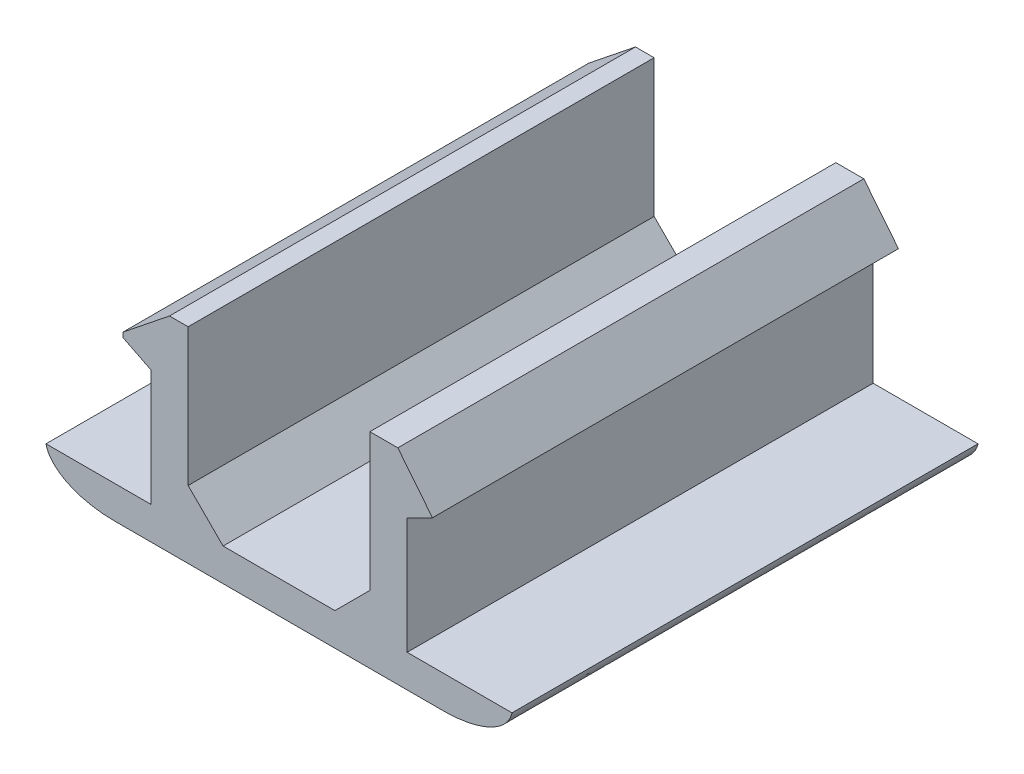
ISO-10303-21;
HEADER;
FILE_DESCRIPTION(('STEP AP214'),'2;1');
FILE_NAME('part.step','',(''),(''),'','','');
FILE_SCHEMA(('AUTOMOTIVE_DESIGN { 1 0 10303 214 1 1 1 1 }'));
ENDSEC;
DATA;
#1=APPLICATION_CONTEXT('core data for automotive mechanical design processes');
#2=APPLICATION_PROTOCOL_DEFINITION('international standard','automotive_design',2000,#1);
#3=PRODUCT_CONTEXT('',#1,'mechanical');
#4=PRODUCT('Part','Part','',(#3));
#5=PRODUCT_RELATED_PRODUCT_CATEGORY('part','',(#4));
#6=PRODUCT_DEFINITION_FORMATION('','',#4);
#7=PRODUCT_DEFINITION_CONTEXT('part definition',#1,'design');
#8=PRODUCT_DEFINITION('design','',#6,#7);
#9=PRODUCT_DEFINITION_SHAPE('','',#8);
#10=(LENGTH_UNIT() NAMED_UNIT(*) SI_UNIT(.MILLI.,.METRE.));
#11=(NAMED_UNIT(*) PLANE_ANGLE_UNIT() SI_UNIT($,.RADIAN.));
#12=(NAMED_UNIT(*) SI_UNIT($,.STERADIAN.) SOLID_ANGLE_UNIT());
#13=UNCERTAINTY_MEASURE_WITH_UNIT(LENGTH_MEASURE(1.E-05),#10,'distance_accuracy_value','');
#14=(GEOMETRIC_REPRESENTATION_CONTEXT(3) GLOBAL_UNCERTAINTY_ASSIGNED_CONTEXT((#13)) GLOBAL_UNIT_ASSIGNED_CONTEXT((#10,
#11,#12)) REPRESENTATION_CONTEXT('',''));
#15=CARTESIAN_POINT('',(0.,0.,0.));
#16=DIRECTION('',(0.,0.,1.));
#17=DIRECTION('',(1.,0.,0.));
#18=AXIS2_PLACEMENT_3D('',#15,#16,#17);
#19=CARTESIAN_POINT('',(0.,0.,10.));
#20=DIRECTION('',(0.,1.,0.));
#21=DIRECTION('',(0.,0.,1.));
#22=AXIS2_PLACEMENT_3D('',#19,#20,#21);
#23=PLANE('',#22);
#24=DIRECTION('',(1.,0.,0.));
#25=VECTOR('',#24,1.);
#26=CARTESIAN_POINT('',(0.,0.,10.));
#27=LINE('',#26,#25);
#28=CARTESIAN_POINT('',(1.46969384566986,0.,10.));
#29=VERTEX_POINT('',#28);
#30=CARTESIAN_POINT('',(8.53030615433009,0.,10.));
#31=VERTEX_POINT('',#30);
#32=EDGE_CURVE('E183',#29,#31,#27,.T.);
#33=ORIENTED_EDGE('',*,*,#32,.F.);
#34=CARTESIAN_POINT('',(1.46969384566991,0.,-0.5));
#35=CARTESIAN_POINT('',(1.46969384566991,0.,3.16666666666667));
#36=CARTESIAN_POINT('',(1.46969384566991,0.,6.83333333333332));
#37=CARTESIAN_POINT('',(1.46969384566991,0.,10.5));
#38=(BOUNDED_CURVE() B_SPLINE_CURVE(3,(#34,#35,#36,#37),.UNSPECIFIED.,.F.,
.F.) B_SPLINE_CURVE_WITH_KNOTS((4,4),(-0.0005,0.0105),
.UNSPECIFIED.) CURVE() GEOMETRIC_REPRESENTATION_ITEM() RATIONAL_B_SPLINE_CURVE((1.,1.,1.,1.)) REPRESENTATION_ITEM(''));
#39=CARTESIAN_POINT('',(1.46969384566991,0.,0.));
#40=VERTEX_POINT('',#39);
#41=EDGE_CURVE('E528',#29,#40,#38,.F.);
#42=ORIENTED_EDGE('',*,*,#41,.T.);
#43=DIRECTION('',(1.,0.,0.));
#44=VECTOR('',#43,1.);
#45=CARTESIAN_POINT('',(0.,0.,0.));
#46=LINE('',#45,#44);
#47=CARTESIAN_POINT('',(8.53030615433009,0.,0.));
#48=VERTEX_POINT('',#47);
#49=EDGE_CURVE('E417',#40,#48,#46,.T.);
#50=ORIENTED_EDGE('',*,*,#49,.T.);
#51=CARTESIAN_POINT('',(8.53030615433009,0.,10.5));
#52=CARTESIAN_POINT('',(8.53030615433009,0.,6.83333333333332));
#53=CARTESIAN_POINT('',(8.53030615433009,0.,3.16666666666667));
#54=CARTESIAN_POINT('',(8.53030615433009,0.,-0.5));
#55=(BOUNDED_CURVE() B_SPLINE_CURVE(3,(#51,#52,#53,#54),.UNSPECIFIED.,.F.,
.F.) B_SPLINE_CURVE_WITH_KNOTS((4,4),(-0.0005,0.0105),
.UNSPECIFIED.) CURVE() GEOMETRIC_REPRESENTATION_ITEM() RATIONAL_B_SPLINE_CURVE((1.,1.,1.,1.)) REPRESENTATION_ITEM(''));
#56=EDGE_CURVE('E207',#48,#31,#55,.F.);
#57=ORIENTED_EDGE('',*,*,#56,.T.);
#58=EDGE_LOOP('',(#33,#42,#50,#57));
#59=FACE_BOUND('',#58,.T.);
#60=ADVANCED_FACE('F45',(#59),#23,.F.);
#61=CARTESIAN_POINT('',(10.,0.7,10.));
#62=DIRECTION('',(0.,-1.,0.));
#63=DIRECTION('',(0.,0.,-1.));
#64=AXIS2_PLACEMENT_3D('',#61,#62,#63);
#65=PLANE('',#64);
#66=DIRECTION('',(-1.,0.,0.));
#67=VECTOR('',#66,1.);
#68=CARTESIAN_POINT('',(10.,0.7,0.));
#69=LINE('',#68,#67);
#70=CARTESIAN_POINT('',(10.,0.7,0.));
#71=VERTEX_POINT('',#70);
#72=CARTESIAN_POINT('',(7.75,0.7,0.));
#73=VERTEX_POINT('',#72);
#74=EDGE_CURVE('E354',#71,#73,#69,.T.);
#75=ORIENTED_EDGE('',*,*,#74,.T.);
#76=DIRECTION('',(0.,0.,-1.));
#77=VECTOR('',#76,1.);
#78=CARTESIAN_POINT('',(7.75,0.7,10.));
#79=LINE('',#78,#77);
#80=CARTESIAN_POINT('',(7.75,0.7,10.));
#81=VERTEX_POINT('',#80);
#82=EDGE_CURVE('E199',#81,#73,#79,.T.);
#83=ORIENTED_EDGE('',*,*,#82,.F.);
#84=DIRECTION('',(-1.,0.,0.));
#85=VECTOR('',#84,1.);
#86=CARTESIAN_POINT('',(10.,0.7,10.));
#87=LINE('',#86,#85);
#88=CARTESIAN_POINT('',(10.,0.7,10.));
#89=VERTEX_POINT('',#88);
#90=EDGE_CURVE('E180',#89,#81,#87,.T.);
#91=ORIENTED_EDGE('',*,*,#90,.F.);
#92=CARTESIAN_POINT('',(10.,0.7,-0.5));
#93=CARTESIAN_POINT('',(10.,0.7,3.16666666666667));
#94=CARTESIAN_POINT('',(10.,0.7,6.83333333333332));
#95=CARTESIAN_POINT('',(10.,0.7,10.5));
#96=(BOUNDED_CURVE() B_SPLINE_CURVE(3,(#92,#93,#94,#95),.UNSPECIFIED.,.F.,
.F.) B_SPLINE_CURVE_WITH_KNOTS((4,4),(-0.0005,0.0105),
.UNSPECIFIED.) CURVE() GEOMETRIC_REPRESENTATION_ITEM() RATIONAL_B_SPLINE_CURVE((1.,1.,1.,1.)) REPRESENTATION_ITEM(''));
#97=EDGE_CURVE('E195',#89,#71,#96,.F.);
#98=ORIENTED_EDGE('',*,*,#97,.T.);
#99=EDGE_LOOP('',(#75,#83,#91,#98));
#100=FACE_BOUND('',#99,.T.);
#101=ADVANCED_FACE('F194',(#100),#65,.F.);
#102=CARTESIAN_POINT('',(7.75,0.7,10.));
#103=DIRECTION('',(-1.,0.,0.));
#104=DIRECTION('',(0.,0.,1.));
#105=AXIS2_PLACEMENT_3D('',#102,#103,#104);
#106=PLANE('',#105);
#107=DIRECTION('',(0.,1.,0.));
#108=VECTOR('',#107,1.);
#109=CARTESIAN_POINT('',(7.75,0.7,0.));
#110=LINE('',#109,#108);
#111=CARTESIAN_POINT('',(7.75,3.2,0.));
#112=VERTEX_POINT('',#111);
#113=EDGE_CURVE('E425',#73,#112,#110,.T.);
#114=ORIENTED_EDGE('',*,*,#113,.T.);
#115=DIRECTION('',(0.,0.,-1.));
#116=VECTOR('',#115,1.);
#117=CARTESIAN_POINT('',(7.75,3.2,10.));
#118=LINE('',#117,#116);
#119=CARTESIAN_POINT('',(7.75,3.2,10.));
#120=VERTEX_POINT('',#119);
#121=EDGE_CURVE('E413',#120,#112,#118,.T.);
#122=ORIENTED_EDGE('',*,*,#121,.F.);
#123=DIRECTION('',(0.,1.,0.));
#124=VECTOR('',#123,1.);
#125=CARTESIAN_POINT('',(7.75,0.7,10.));
#126=LINE('',#125,#124);
#127=EDGE_CURVE('E201',#81,#120,#126,.T.);
#128=ORIENTED_EDGE('',*,*,#127,.F.);
#129=ORIENTED_EDGE('',*,*,#82,.T.);
#130=EDGE_LOOP('',(#114,#122,#128,#129));
#131=FACE_BOUND('',#130,.T.);
#132=ADVANCED_FACE('F325',(#131),#106,.F.);
#133=CARTESIAN_POINT('',(6.95,4.4,10.));
#134=DIRECTION('',(0.,-1.,0.));
#135=DIRECTION('',(0.,0.,-1.));
#136=AXIS2_PLACEMENT_3D('',#133,#134,#135);
#137=PLANE('',#136);
#138=DIRECTION('',(-1.,0.,0.));
#139=VECTOR('',#138,1.);
#140=CARTESIAN_POINT('',(6.95,4.4,10.));
#141=LINE('',#140,#139);
#142=CARTESIAN_POINT('',(7.55,4.4,10.));
#143=VERTEX_POINT('',#142);
#144=CARTESIAN_POINT('',(6.95,4.4,10.));
#145=VERTEX_POINT('',#144);
#146=EDGE_CURVE('E597',#143,#145,#141,.T.);
#147=ORIENTED_EDGE('',*,*,#146,.F.);
#148=DIRECTION('',(0.,0.,-1.));
#149=VECTOR('',#148,1.);
#150=CARTESIAN_POINT('',(7.55,4.4,10.));
#151=LINE('',#150,#149);
#152=CARTESIAN_POINT('',(7.55,4.4,0.));
#153=VERTEX_POINT('',#152);
#154=EDGE_CURVE('E315',#143,#153,#151,.T.);
#155=ORIENTED_EDGE('',*,*,#154,.T.);
#156=DIRECTION('',(-1.,0.,0.));
#157=VECTOR('',#156,1.);
#158=CARTESIAN_POINT('',(6.95,4.4,0.));
#159=LINE('',#158,#157);
#160=CARTESIAN_POINT('',(6.95,4.4,0.));
#161=VERTEX_POINT('',#160);
#162=EDGE_CURVE('E428',#153,#161,#159,.T.);
#163=ORIENTED_EDGE('',*,*,#162,.T.);
#164=DIRECTION('',(0.,0.,-1.));
#165=VECTOR('',#164,1.);
#166=CARTESIAN_POINT('',(6.95,4.4,10.));
#167=LINE('',#166,#165);
#168=EDGE_CURVE('E410',#145,#161,#167,.T.);
#169=ORIENTED_EDGE('',*,*,#168,.F.);
#170=EDGE_LOOP('',(#147,#155,#163,#169));
#171=FACE_BOUND('',#170,.T.);
#172=ADVANCED_FACE('F586',(#171),#137,.F.);
#173=CARTESIAN_POINT('',(6.95,4.4,10.));
#174=DIRECTION('',(1.,0.,0.));
#175=DIRECTION('',(0.,0.,-1.));
#176=AXIS2_PLACEMENT_3D('',#173,#174,#175);
#177=PLANE('',#176);
#178=DIRECTION('',(0.,-1.,0.));
#179=VECTOR('',#178,1.);
#180=CARTESIAN_POINT('',(6.95,4.4,0.));
#181=LINE('',#180,#179);
#182=CARTESIAN_POINT('',(6.95,1.45,0.));
#183=VERTEX_POINT('',#182);
#184=EDGE_CURVE('E430',#161,#183,#181,.T.);
#185=ORIENTED_EDGE('',*,*,#184,.T.);
#186=DIRECTION('',(0.,0.,1.));
#187=VECTOR('',#186,1.);
#188=CARTESIAN_POINT('',(6.95,1.45,10.));
#189=LINE('',#188,#187);
#190=CARTESIAN_POINT('',(6.95,1.45,10.));
#191=VERTEX_POINT('',#190);
#192=EDGE_CURVE('E477',#183,#191,#189,.T.);
#193=ORIENTED_EDGE('',*,*,#192,.T.);
#194=DIRECTION('',(0.,-1.,0.));
#195=VECTOR('',#194,1.);
#196=CARTESIAN_POINT('',(6.95,4.4,10.));
#197=LINE('',#196,#195);
#198=EDGE_CURVE('E498',#145,#191,#197,.T.);
#199=ORIENTED_EDGE('',*,*,#198,.F.);
#200=ORIENTED_EDGE('',*,*,#168,.T.);
#201=EDGE_LOOP('',(#185,#193,#199,#200));
#202=FACE_BOUND('',#201,.T.);
#203=ADVANCED_FACE('F584',(#202),#177,.F.);
#204=CARTESIAN_POINT('',(3.05,0.7,10.));
#205=DIRECTION('',(0.,-1.,0.));
#206=DIRECTION('',(0.,0.,-1.));
#207=AXIS2_PLACEMENT_3D('',#204,#205,#206);
#208=PLANE('',#207);
#209=DIRECTION('',(-1.,0.,0.));
#210=VECTOR('',#209,1.);
#211=CARTESIAN_POINT('',(3.05,0.7,10.));
#212=LINE('',#211,#210);
#213=CARTESIAN_POINT('',(6.2,0.7,10.));
#214=VERTEX_POINT('',#213);
#215=CARTESIAN_POINT('',(3.8,0.7,10.));
#216=VERTEX_POINT('',#215);
#217=EDGE_CURVE('E494',#214,#216,#212,.T.);
#218=ORIENTED_EDGE('',*,*,#217,.F.);
#219=DIRECTION('',(0.,0.,-1.));
#220=VECTOR('',#219,1.);
#221=CARTESIAN_POINT('',(6.2,0.7,0.));
#222=LINE('',#221,#220);
#223=CARTESIAN_POINT('',(6.2,0.7,0.));
#224=VERTEX_POINT('',#223);
#225=EDGE_CURVE('E474',#214,#224,#222,.T.);
#226=ORIENTED_EDGE('',*,*,#225,.T.);
#227=DIRECTION('',(-1.,0.,0.));
#228=VECTOR('',#227,1.);
#229=CARTESIAN_POINT('',(3.05,0.7,0.));
#230=LINE('',#229,#228);
#231=CARTESIAN_POINT('',(3.8,0.7,0.));
#232=VERTEX_POINT('',#231);
#233=EDGE_CURVE('E433',#224,#232,#230,.T.);
#234=ORIENTED_EDGE('',*,*,#233,.T.);
#235=DIRECTION('',(0.,0.,1.));
#236=VECTOR('',#235,1.);
#237=CARTESIAN_POINT('',(3.8,0.7,10.));
#238=LINE('',#237,#236);
#239=EDGE_CURVE('E472',#232,#216,#238,.T.);
#240=ORIENTED_EDGE('',*,*,#239,.T.);
#241=EDGE_LOOP('',(#218,#226,#234,#240));
#242=FACE_BOUND('',#241,.T.);
#243=ADVANCED_FACE('F488',(#242),#208,.F.);
#244=CARTESIAN_POINT('',(3.05,4.4,10.));
#245=DIRECTION('',(-1.,0.,0.));
#246=DIRECTION('',(0.,-1.,0.));
#247=AXIS2_PLACEMENT_3D('',#244,#245,#246);
#248=PLANE('',#247);
#249=DIRECTION('',(0.,1.,0.));
#250=VECTOR('',#249,1.);
#251=CARTESIAN_POINT('',(3.05,4.4,10.));
#252=LINE('',#251,#250);
#253=CARTESIAN_POINT('',(3.05,1.45,10.));
#254=VERTEX_POINT('',#253);
#255=CARTESIAN_POINT('',(3.05,4.4,10.));
#256=VERTEX_POINT('',#255);
#257=EDGE_CURVE('E492',#254,#256,#252,.T.);
#258=ORIENTED_EDGE('',*,*,#257,.F.);
#259=DIRECTION('',(0.,0.,-1.));
#260=VECTOR('',#259,1.);
#261=CARTESIAN_POINT('',(3.05,1.45,0.));
#262=LINE('',#261,#260);
#263=CARTESIAN_POINT('',(3.05,1.45,0.));
#264=VERTEX_POINT('',#263);
#265=EDGE_CURVE('E479',#254,#264,#262,.T.);
#266=ORIENTED_EDGE('',*,*,#265,.T.);
#267=DIRECTION('',(0.,1.,0.));
#268=VECTOR('',#267,1.);
#269=CARTESIAN_POINT('',(3.05,4.4,0.));
#270=LINE('',#269,#268);
#271=CARTESIAN_POINT('',(3.05,4.4,0.));
#272=VERTEX_POINT('',#271);
#273=EDGE_CURVE('E436',#264,#272,#270,.T.);
#274=ORIENTED_EDGE('',*,*,#273,.T.);
#275=DIRECTION('',(0.,0.,-1.));
#276=VECTOR('',#275,1.);
#277=CARTESIAN_POINT('',(3.05,4.4,10.));
#278=LINE('',#277,#276);
#279=EDGE_CURVE('E407',#256,#272,#278,.T.);
#280=ORIENTED_EDGE('',*,*,#279,.F.);
#281=EDGE_LOOP('',(#258,#266,#274,#280));
#282=FACE_BOUND('',#281,.T.);
#283=ADVANCED_FACE('F491',(#282),#248,.F.);
#284=CARTESIAN_POINT('',(1.65,4.4,10.));
#285=DIRECTION('',(0.,-1.,0.));
#286=DIRECTION('',(0.,0.,-1.));
#287=AXIS2_PLACEMENT_3D('',#284,#285,#286);
#288=PLANE('',#287);
#289=DIRECTION('',(-1.,0.,0.));
#290=VECTOR('',#289,1.);
#291=CARTESIAN_POINT('',(1.65,4.4,0.));
#292=LINE('',#291,#290);
#293=CARTESIAN_POINT('',(2.65,4.4,0.));
#294=VERTEX_POINT('',#293);
#295=EDGE_CURVE('E398',#272,#294,#292,.T.);
#296=ORIENTED_EDGE('',*,*,#295,.T.);
#297=DIRECTION('',(0.,0.,1.));
#298=VECTOR('',#297,1.);
#299=CARTESIAN_POINT('',(2.65,4.4,10.));
#300=LINE('',#299,#298);
#301=CARTESIAN_POINT('',(2.65,4.4,10.));
#302=VERTEX_POINT('',#301);
#303=EDGE_CURVE('E443',#294,#302,#300,.T.);
#304=ORIENTED_EDGE('',*,*,#303,.T.);
#305=DIRECTION('',(-1.,0.,0.));
#306=VECTOR('',#305,1.);
#307=CARTESIAN_POINT('',(1.65,4.4,10.));
#308=LINE('',#307,#306);
#309=EDGE_CURVE('E493',#256,#302,#308,.T.);
#310=ORIENTED_EDGE('',*,*,#309,.F.);
#311=ORIENTED_EDGE('',*,*,#279,.T.);
#312=EDGE_LOOP('',(#296,#304,#310,#311));
#313=FACE_BOUND('',#312,.T.);
#314=ADVANCED_FACE('F441',(#313),#288,.F.);
#315=CARTESIAN_POINT('',(1.65,4.4,10.));
#316=DIRECTION('',(1.,0.,0.));
#317=DIRECTION('',(0.,1.,0.));
#318=AXIS2_PLACEMENT_3D('',#315,#316,#317);
#319=PLANE('',#318);
#320=DIRECTION('',(0.,-1.,0.));
#321=VECTOR('',#320,1.);
#322=CARTESIAN_POINT('',(1.65,4.4,0.));
#323=LINE('',#322,#321);
#324=CARTESIAN_POINT('',(1.65,3.6,0.));
#325=VERTEX_POINT('',#324);
#326=CARTESIAN_POINT('',(1.65,3.5,0.));
#327=VERTEX_POINT('',#326);
#328=EDGE_CURVE('E391',#325,#327,#323,.T.);
#329=ORIENTED_EDGE('',*,*,#328,.T.);
#330=DIRECTION('',(0.,0.,1.));
#331=VECTOR('',#330,1.);
#332=CARTESIAN_POINT('',(1.65,3.5,10.));
#333=LINE('',#332,#331);
#334=CARTESIAN_POINT('',(1.65,3.5,10.));
#335=VERTEX_POINT('',#334);
#336=EDGE_CURVE('E470',#327,#335,#333,.T.);
#337=ORIENTED_EDGE('',*,*,#336,.T.);
#338=DIRECTION('',(0.,-1.,0.));
#339=VECTOR('',#338,1.);
#340=CARTESIAN_POINT('',(1.65,4.4,10.));
#341=LINE('',#340,#339);
#342=CARTESIAN_POINT('',(1.65,3.6,10.));
#343=VERTEX_POINT('',#342);
#344=EDGE_CURVE('E496',#343,#335,#341,.T.);
#345=ORIENTED_EDGE('',*,*,#344,.F.);
#346=DIRECTION('',(0.,0.,-1.));
#347=VECTOR('',#346,1.);
#348=CARTESIAN_POINT('',(1.65,3.6,10.));
#349=LINE('',#348,#347);
#350=EDGE_CURVE('E455',#343,#325,#349,.T.);
#351=ORIENTED_EDGE('',*,*,#350,.T.);
#352=EDGE_LOOP('',(#329,#337,#345,#351));
#353=FACE_BOUND('',#352,.T.);
#354=ADVANCED_FACE('F568',(#353),#319,.F.);
#355=CARTESIAN_POINT('',(2.25,0.7,10.));
#356=DIRECTION('',(1.,0.,0.));
#357=DIRECTION('',(0.,0.,-1.));
#358=AXIS2_PLACEMENT_3D('',#355,#356,#357);
#359=PLANE('',#358);
#360=DIRECTION('',(0.,-1.,0.));
#361=VECTOR('',#360,1.);
#362=CARTESIAN_POINT('',(2.25,0.7,0.));
#363=LINE('',#362,#361);
#364=CARTESIAN_POINT('',(2.25,3.2,0.));
#365=VERTEX_POINT('',#364);
#366=CARTESIAN_POINT('',(2.25,0.7,0.));
#367=VERTEX_POINT('',#366);
#368=EDGE_CURVE('E383',#365,#367,#363,.T.);
#369=ORIENTED_EDGE('',*,*,#368,.T.);
#370=DIRECTION('',(0.,0.,-1.));
#371=VECTOR('',#370,1.);
#372=CARTESIAN_POINT('',(2.25,0.7,10.));
#373=LINE('',#372,#371);
#374=CARTESIAN_POINT('',(2.25,0.7,10.));
#375=VERTEX_POINT('',#374);
#376=EDGE_CURVE('E402',#375,#367,#373,.T.);
#377=ORIENTED_EDGE('',*,*,#376,.F.);
#378=DIRECTION('',(0.,-1.,0.));
#379=VECTOR('',#378,1.);
#380=CARTESIAN_POINT('',(2.25,0.7,10.));
#381=LINE('',#380,#379);
#382=CARTESIAN_POINT('',(2.25,3.2,10.));
#383=VERTEX_POINT('',#382);
#384=EDGE_CURVE('E423',#383,#375,#381,.T.);
#385=ORIENTED_EDGE('',*,*,#384,.F.);
#386=DIRECTION('',(0.,0.,-1.));
#387=VECTOR('',#386,1.);
#388=CARTESIAN_POINT('',(2.25,3.2,10.));
#389=LINE('',#388,#387);
#390=EDGE_CURVE('E404',#383,#365,#389,.T.);
#391=ORIENTED_EDGE('',*,*,#390,.T.);
#392=EDGE_LOOP('',(#369,#377,#385,#391));
#393=FACE_BOUND('',#392,.T.);
#394=ADVANCED_FACE('F570',(#393),#359,.F.);
#395=CARTESIAN_POINT('',(0.,0.7,10.));
#396=DIRECTION('',(0.,-1.,0.));
#397=DIRECTION('',(0.,0.,-1.));
#398=AXIS2_PLACEMENT_3D('',#395,#396,#397);
#399=PLANE('',#398);
#400=DIRECTION('',(-1.,0.,0.));
#401=VECTOR('',#400,1.);
#402=CARTESIAN_POINT('',(0.,0.7,0.));
#403=LINE('',#402,#401);
#404=CARTESIAN_POINT('',(0.,0.7,0.));
#405=VERTEX_POINT('',#404);
#406=EDGE_CURVE('E376',#367,#405,#403,.T.);
#407=ORIENTED_EDGE('',*,*,#406,.T.);
#408=CARTESIAN_POINT('',(0.,0.7,10.5));
#409=CARTESIAN_POINT('',(0.,0.7,6.83333333333332));
#410=CARTESIAN_POINT('',(0.,0.7,3.16666666666667));
#411=CARTESIAN_POINT('',(0.,0.7,-0.5));
#412=(BOUNDED_CURVE() B_SPLINE_CURVE(3,(#408,#409,#410,#411),.UNSPECIFIED.,.F.,
.F.) B_SPLINE_CURVE_WITH_KNOTS((4,4),(-0.0005,0.0105),
.UNSPECIFIED.) CURVE() GEOMETRIC_REPRESENTATION_ITEM() RATIONAL_B_SPLINE_CURVE((1.,1.,1.,1.)) REPRESENTATION_ITEM(''));
#413=CARTESIAN_POINT('',(0.,0.7,10.));
#414=VERTEX_POINT('',#413);
#415=EDGE_CURVE('E405',#414,#405,#412,.T.);
#416=ORIENTED_EDGE('',*,*,#415,.F.);
#417=DIRECTION('',(-1.,0.,0.));
#418=VECTOR('',#417,1.);
#419=CARTESIAN_POINT('',(0.,0.7,10.));
#420=LINE('',#419,#418);
#421=EDGE_CURVE('E504',#375,#414,#420,.T.);
#422=ORIENTED_EDGE('',*,*,#421,.F.);
#423=ORIENTED_EDGE('',*,*,#376,.T.);
#424=EDGE_LOOP('',(#407,#416,#422,#423));
#425=FACE_BOUND('',#424,.T.);
#426=ADVANCED_FACE('F367',(#425),#399,.F.);
#427=CARTESIAN_POINT('',(0.,0.,10.));
#428=DIRECTION('',(0.,0.,1.));
#429=DIRECTION('',(1.,0.,0.));
#430=AXIS2_PLACEMENT_3D('',#427,#428,#429);
#431=PLANE('',#430);
#432=ORIENTED_EDGE('',*,*,#127,.T.);
#433=DIRECTION('',(-0.894427190999916,-0.447213595499958,0.));
#434=VECTOR('',#433,1.);
#435=CARTESIAN_POINT('',(0.27,-0.54,10.));
#436=LINE('',#435,#434);
#437=CARTESIAN_POINT('',(8.29285714285714,3.47142857142857,10.));
#438=VERTEX_POINT('',#437);
#439=EDGE_CURVE('E468',#120,#438,#436,.F.);
#440=ORIENTED_EDGE('',*,*,#439,.T.);
#441=DIRECTION('',(0.624695047554425,-0.78086880944303,0.));
#442=VECTOR('',#441,1.);
#443=CARTESIAN_POINT('',(6.75,5.4,10.));
#444=LINE('',#443,#442);
#445=EDGE_CURVE('E459',#438,#143,#444,.F.);
#446=ORIENTED_EDGE('',*,*,#445,.T.);
#447=ORIENTED_EDGE('',*,*,#146,.T.);
#448=ORIENTED_EDGE('',*,*,#198,.T.);
#449=DIRECTION('',(0.707106781186548,0.707106781186548,0.));
#450=VECTOR('',#449,1.);
#451=CARTESIAN_POINT('',(6.2,0.7,10.));
#452=LINE('',#451,#450);
#453=EDGE_CURVE('E483',#191,#214,#452,.F.);
#454=ORIENTED_EDGE('',*,*,#453,.T.);
#455=ORIENTED_EDGE('',*,*,#217,.T.);
#456=DIRECTION('',(0.707106781186548,-0.707106781186547,0.));
#457=VECTOR('',#456,1.);
#458=CARTESIAN_POINT('',(3.05,1.45,10.));
#459=LINE('',#458,#457);
#460=EDGE_CURVE('E13',#216,#254,#459,.F.);
#461=ORIENTED_EDGE('',*,*,#460,.T.);
#462=ORIENTED_EDGE('',*,*,#257,.T.);
#463=ORIENTED_EDGE('',*,*,#309,.T.);
#464=DIRECTION('',(0.78086880944303,0.624695047554424,0.));
#465=VECTOR('',#464,1.);
#466=CARTESIAN_POINT('',(-1.11219512195122,1.39024390243902,10.));
#467=LINE('',#466,#465);
#468=EDGE_CURVE('E453',#302,#343,#467,.F.);
#469=ORIENTED_EDGE('',*,*,#468,.T.);
#470=ORIENTED_EDGE('',*,*,#344,.T.);
#471=DIRECTION('',(-0.894427190999916,0.447213595499958,0.));
#472=VECTOR('',#471,1.);
#473=CARTESIAN_POINT('',(1.73,3.46,10.));
#474=LINE('',#473,#472);
#475=EDGE_CURVE('E466',#335,#383,#474,.F.);
#476=ORIENTED_EDGE('',*,*,#475,.T.);
#477=ORIENTED_EDGE('',*,*,#384,.T.);
#478=ORIENTED_EDGE('',*,*,#421,.T.);
#479=CARTESIAN_POINT('',(1.46969384566991,0.,10.));
#480=CARTESIAN_POINT('',(0.142886901662352,0.,10.));
#481=CARTESIAN_POINT('',(0.,0.7,10.));
#482=(BOUNDED_CURVE() B_SPLINE_CURVE(2,(#479,#480,#481),.UNSPECIFIED.,.F.,
.F.) B_SPLINE_CURVE_WITH_KNOTS((3,3),(0.,1.),
.UNSPECIFIED.) CURVE() GEOMETRIC_REPRESENTATION_ITEM() RATIONAL_B_SPLINE_CURVE((1.,
0.774596669241483,1.)) REPRESENTATION_ITEM(''));
#483=EDGE_CURVE('E188',#414,#29,#482,.F.);
#484=ORIENTED_EDGE('',*,*,#483,.T.);
#485=ORIENTED_EDGE('',*,*,#32,.T.);
#486=CARTESIAN_POINT('',(10.,0.7,10.));
#487=CARTESIAN_POINT('',(9.85711309833765,0.,10.));
#488=CARTESIAN_POINT('',(8.53030615433009,0.,10.));
#489=(BOUNDED_CURVE() B_SPLINE_CURVE(2,(#486,#487,#488),.UNSPECIFIED.,.F.,
.F.) B_SPLINE_CURVE_WITH_KNOTS((3,3),(0.,1.),
.UNSPECIFIED.) CURVE() GEOMETRIC_REPRESENTATION_ITEM() RATIONAL_B_SPLINE_CURVE((1.,
0.774596669241483,1.)) REPRESENTATION_ITEM(''));
#490=EDGE_CURVE('E175',#31,#89,#489,.F.);
#491=ORIENTED_EDGE('',*,*,#490,.T.);
#492=ORIENTED_EDGE('',*,*,#90,.T.);
#493=EDGE_LOOP('',(#432,#440,#446,#447,#448,#454,#455,#461,#462,#463,#469,#470,#476,#477,#478,
#484,#485,#491,#492));
#494=FACE_BOUND('',#493,.T.);
#495=ADVANCED_FACE('F179',(#494),#431,.T.);
#496=CARTESIAN_POINT('',(0.,0.,0.));
#497=DIRECTION('',(0.,0.,1.));
#498=DIRECTION('',(1.,0.,0.));
#499=AXIS2_PLACEMENT_3D('',#496,#497,#498);
#500=PLANE('',#499);
#501=DIRECTION('',(-0.624695047554425,0.78086880944303,0.));
#502=VECTOR('',#501,1.);
#503=CARTESIAN_POINT('',(7.55,4.4,0.));
#504=LINE('',#503,#502);
#505=CARTESIAN_POINT('',(8.29285714285714,3.47142857142857,0.));
#506=VERTEX_POINT('',#505);
#507=EDGE_CURVE('E606',#153,#506,#504,.F.);
#508=ORIENTED_EDGE('',*,*,#507,.T.);
#509=DIRECTION('',(0.894427190999916,0.447213595499958,0.));
#510=VECTOR('',#509,1.);
#511=CARTESIAN_POINT('',(8.35,3.5,0.));
#512=LINE('',#511,#510);
#513=EDGE_CURVE('E464',#506,#112,#512,.F.);
#514=ORIENTED_EDGE('',*,*,#513,.T.);
#515=ORIENTED_EDGE('',*,*,#113,.F.);
#516=ORIENTED_EDGE('',*,*,#74,.F.);
#517=CARTESIAN_POINT('',(8.53030615433009,0.,0.));
#518=CARTESIAN_POINT('',(9.85711309833765,0.,0.));
#519=CARTESIAN_POINT('',(10.,0.7,0.));
#520=(BOUNDED_CURVE() B_SPLINE_CURVE(2,(#517,#518,#519),.UNSPECIFIED.,.F.,
.F.) B_SPLINE_CURVE_WITH_KNOTS((3,3),(0.,1.),
.UNSPECIFIED.) CURVE() GEOMETRIC_REPRESENTATION_ITEM() RATIONAL_B_SPLINE_CURVE((1.,
0.774596669241483,1.)) REPRESENTATION_ITEM(''));
#521=EDGE_CURVE('E205',#71,#48,#520,.F.);
#522=ORIENTED_EDGE('',*,*,#521,.T.);
#523=ORIENTED_EDGE('',*,*,#49,.F.);
#524=CARTESIAN_POINT('',(0.,0.7,0.));
#525=CARTESIAN_POINT('',(0.142886901662352,0.,0.));
#526=CARTESIAN_POINT('',(1.46969384566991,0.,0.));
#527=(BOUNDED_CURVE() B_SPLINE_CURVE(2,(#524,#525,#526),.UNSPECIFIED.,.F.,
.F.) B_SPLINE_CURVE_WITH_KNOTS((3,3),(0.,1.),
.UNSPECIFIED.) CURVE() GEOMETRIC_REPRESENTATION_ITEM() RATIONAL_B_SPLINE_CURVE((1.,
0.774596669241483,1.)) REPRESENTATION_ITEM(''));
#528=EDGE_CURVE('E189',#40,#405,#527,.F.);
#529=ORIENTED_EDGE('',*,*,#528,.T.);
#530=ORIENTED_EDGE('',*,*,#406,.F.);
#531=ORIENTED_EDGE('',*,*,#368,.F.);
#532=DIRECTION('',(0.894427190999916,-0.447213595499958,0.));
#533=VECTOR('',#532,1.);
#534=CARTESIAN_POINT('',(2.25,3.2,0.));
#535=LINE('',#534,#533);
#536=EDGE_CURVE('E457',#365,#327,#535,.F.);
#537=ORIENTED_EDGE('',*,*,#536,.T.);
#538=ORIENTED_EDGE('',*,*,#328,.F.);
#539=DIRECTION('',(-0.78086880944303,-0.624695047554424,0.));
#540=VECTOR('',#539,1.);
#541=CARTESIAN_POINT('',(1.65,3.6,0.));
#542=LINE('',#541,#540);
#543=EDGE_CURVE('E451',#325,#294,#542,.F.);
#544=ORIENTED_EDGE('',*,*,#543,.T.);
#545=ORIENTED_EDGE('',*,*,#295,.F.);
#546=ORIENTED_EDGE('',*,*,#273,.F.);
#547=DIRECTION('',(-0.707106781186548,0.707106781186547,0.));
#548=VECTOR('',#547,1.);
#549=CARTESIAN_POINT('',(2.25,2.25,0.));
#550=LINE('',#549,#548);
#551=EDGE_CURVE('E54',#264,#232,#550,.F.);
#552=ORIENTED_EDGE('',*,*,#551,.T.);
#553=ORIENTED_EDGE('',*,*,#233,.F.);
#554=DIRECTION('',(-0.707106781186548,-0.707106781186548,0.));
#555=VECTOR('',#554,1.);
#556=CARTESIAN_POINT('',(2.75,-2.75,0.));
#557=LINE('',#556,#555);
#558=EDGE_CURVE('E481',#224,#183,#557,.F.);
#559=ORIENTED_EDGE('',*,*,#558,.T.);
#560=ORIENTED_EDGE('',*,*,#184,.F.);
#561=ORIENTED_EDGE('',*,*,#162,.F.);
#562=EDGE_LOOP('',(#508,#514,#515,#516,#522,#523,#529,#530,#531,#537,#538,#544,#545,#546,#552,
#553,#559,#560,#561));
#563=FACE_BOUND('',#562,.T.);
#564=ADVANCED_FACE('F356',(#563),#500,.F.);
#565=CARTESIAN_POINT('',(1.46969384566991,0.,10.5));
#566=CARTESIAN_POINT('',(1.46969384566991,0.,6.83333333333332));
#567=CARTESIAN_POINT('',(1.46969384566991,0.,3.16666666666667));
#568=CARTESIAN_POINT('',(1.46969384566991,0.,-0.5));
#569=CARTESIAN_POINT('',(0.142886901662352,0.,10.5));
#570=CARTESIAN_POINT('',(0.142886901662352,0.,6.83333333333332));
#571=CARTESIAN_POINT('',(0.142886901662352,0.,3.16666666666667));
#572=CARTESIAN_POINT('',(0.142886901662352,0.,-0.5));
#573=CARTESIAN_POINT('',(0.,0.7,10.5));
#574=CARTESIAN_POINT('',(0.,0.7,6.83333333333332));
#575=CARTESIAN_POINT('',(0.,0.7,3.16666666666667));
#576=CARTESIAN_POINT('',(0.,0.7,-0.5));
#577=(BOUNDED_SURFACE() B_SPLINE_SURFACE(2,3,((#565,#566,#567,#568),(#569,#570,#571,#572),(#573,
#574,#575,#576)),.UNSPECIFIED.,.F.,.F.,.F.) B_SPLINE_SURFACE_WITH_KNOTS((3,3),(4,4),(0.,1.),
(-0.0005,0.0105),.UNSPECIFIED.) GEOMETRIC_REPRESENTATION_ITEM() RATIONAL_B_SPLINE_SURFACE(((1.,
1.,1.,1.),(0.774596669241483,0.774596669241483,0.774596669241483,0.774596669241483),(1.,1.,1.,1.))) REPRESENTATION_ITEM('') SURFACE());
#578=ORIENTED_EDGE('',*,*,#483,.F.);
#579=ORIENTED_EDGE('',*,*,#415,.T.);
#580=ORIENTED_EDGE('',*,*,#528,.F.);
#581=ORIENTED_EDGE('',*,*,#41,.F.);
#582=EDGE_LOOP('',(#578,#579,#580,#581));
#583=FACE_BOUND('',#582,.T.);
#584=ADVANCED_FACE('F233',(#583),#577,.T.);
#585=CARTESIAN_POINT('',(10.,0.7,10.5));
#586=CARTESIAN_POINT('',(10.,0.7,6.83333333333332));
#587=CARTESIAN_POINT('',(10.,0.7,3.16666666666667));
#588=CARTESIAN_POINT('',(10.,0.7,-0.5));
#589=CARTESIAN_POINT('',(9.85711309833765,0.,10.5));
#590=CARTESIAN_POINT('',(9.85711309833765,0.,6.83333333333332));
#591=CARTESIAN_POINT('',(9.85711309833765,0.,3.16666666666667));
#592=CARTESIAN_POINT('',(9.85711309833765,0.,-0.5));
#593=CARTESIAN_POINT('',(8.53030615433009,0.,10.5));
#594=CARTESIAN_POINT('',(8.53030615433009,0.,6.83333333333332));
#595=CARTESIAN_POINT('',(8.53030615433009,0.,3.16666666666667));
#596=CARTESIAN_POINT('',(8.53030615433009,0.,-0.5));
#597=(BOUNDED_SURFACE() B_SPLINE_SURFACE(2,3,((#585,#586,#587,#588),(#589,#590,#591,#592),(#593,
#594,#595,#596)),.UNSPECIFIED.,.F.,.F.,.F.) B_SPLINE_SURFACE_WITH_KNOTS((3,3),(4,4),(0.,1.),
(-0.0005,0.0105),.UNSPECIFIED.) GEOMETRIC_REPRESENTATION_ITEM() RATIONAL_B_SPLINE_SURFACE(((1.,
1.,1.,1.),(0.774596669241483,0.774596669241483,0.774596669241483,0.774596669241483),(1.,1.,1.,1.))) REPRESENTATION_ITEM('') SURFACE());
#598=ORIENTED_EDGE('',*,*,#490,.F.);
#599=ORIENTED_EDGE('',*,*,#56,.F.);
#600=ORIENTED_EDGE('',*,*,#521,.F.);
#601=ORIENTED_EDGE('',*,*,#97,.F.);
#602=EDGE_LOOP('',(#598,#599,#600,#601));
#603=FACE_BOUND('',#602,.T.);
#604=ADVANCED_FACE('F204',(#603),#597,.T.);
#605=CARTESIAN_POINT('',(7.55,4.4,10.));
#606=DIRECTION('',(-0.78086880944303,-0.624695047554425,0.));
#607=DIRECTION('',(0.,0.,-1.));
#608=AXIS2_PLACEMENT_3D('',#605,#606,#607);
#609=PLANE('',#608);
#610=ORIENTED_EDGE('',*,*,#445,.F.);
#611=DIRECTION('',(0.,0.,-1.));
#612=VECTOR('',#611,1.);
#613=CARTESIAN_POINT('',(8.29285714285714,3.47142857142857,10.));
#614=LINE('',#613,#612);
#615=EDGE_CURVE('E454',#438,#506,#614,.T.);
#616=ORIENTED_EDGE('',*,*,#615,.T.);
#617=ORIENTED_EDGE('',*,*,#507,.F.);
#618=ORIENTED_EDGE('',*,*,#154,.F.);
#619=EDGE_LOOP('',(#610,#616,#617,#618));
#620=FACE_BOUND('',#619,.T.);
#621=ADVANCED_FACE('F232',(#620),#609,.F.);
#622=CARTESIAN_POINT('',(1.65,3.6,10.));
#623=DIRECTION('',(0.624695047554424,-0.78086880944303,0.));
#624=DIRECTION('',(0.,0.,-1.));
#625=AXIS2_PLACEMENT_3D('',#622,#623,#624);
#626=PLANE('',#625);
#627=ORIENTED_EDGE('',*,*,#468,.F.);
#628=ORIENTED_EDGE('',*,*,#303,.F.);
#629=ORIENTED_EDGE('',*,*,#543,.F.);
#630=ORIENTED_EDGE('',*,*,#350,.F.);
#631=EDGE_LOOP('',(#627,#628,#629,#630));
#632=FACE_BOUND('',#631,.T.);
#633=ADVANCED_FACE('F449',(#632),#626,.F.);
#634=CARTESIAN_POINT('',(8.35,3.5,10.));
#635=DIRECTION('',(-0.447213595499958,0.894427190999916,0.));
#636=DIRECTION('',(0.,0.,-1.));
#637=AXIS2_PLACEMENT_3D('',#634,#635,#636);
#638=PLANE('',#637);
#639=ORIENTED_EDGE('',*,*,#439,.F.);
#640=ORIENTED_EDGE('',*,*,#121,.T.);
#641=ORIENTED_EDGE('',*,*,#513,.F.);
#642=ORIENTED_EDGE('',*,*,#615,.F.);
#643=EDGE_LOOP('',(#639,#640,#641,#642));
#644=FACE_BOUND('',#643,.T.);
#645=ADVANCED_FACE('F620',(#644),#638,.F.);
#646=CARTESIAN_POINT('',(2.25,3.2,10.));
#647=DIRECTION('',(0.447213595499958,0.894427190999916,0.));
#648=DIRECTION('',(0.,0.,-1.));
#649=AXIS2_PLACEMENT_3D('',#646,#647,#648);
#650=PLANE('',#649);
#651=ORIENTED_EDGE('',*,*,#475,.F.);
#652=ORIENTED_EDGE('',*,*,#336,.F.);
#653=ORIENTED_EDGE('',*,*,#536,.F.);
#654=ORIENTED_EDGE('',*,*,#390,.F.);
#655=EDGE_LOOP('',(#651,#652,#653,#654));
#656=FACE_BOUND('',#655,.T.);
#657=ADVANCED_FACE('F569',(#656),#650,.F.);
#658=CARTESIAN_POINT('',(6.2,0.7,10.));
#659=DIRECTION('',(-0.707106781186548,0.707106781186548,0.));
#660=DIRECTION('',(0.,0.,1.));
#661=AXIS2_PLACEMENT_3D('',#658,#659,#660);
#662=PLANE('',#661);
#663=ORIENTED_EDGE('',*,*,#453,.F.);
#664=ORIENTED_EDGE('',*,*,#192,.F.);
#665=ORIENTED_EDGE('',*,*,#558,.F.);
#666=ORIENTED_EDGE('',*,*,#225,.F.);
#667=EDGE_LOOP('',(#663,#664,#665,#666));
#668=FACE_BOUND('',#667,.T.);
#669=ADVANCED_FACE('F629',(#668),#662,.T.);
#670=CARTESIAN_POINT('',(3.05,1.45,10.));
#671=DIRECTION('',(0.707106781186547,0.707106781186548,0.));
#672=DIRECTION('',(0.,0.,1.));
#673=AXIS2_PLACEMENT_3D('',#670,#671,#672);
#674=PLANE('',#673);
#675=ORIENTED_EDGE('',*,*,#460,.F.);
#676=ORIENTED_EDGE('',*,*,#239,.F.);
#677=ORIENTED_EDGE('',*,*,#551,.F.);
#678=ORIENTED_EDGE('',*,*,#265,.F.);
#679=EDGE_LOOP('',(#675,#676,#677,#678));
#680=FACE_BOUND('',#679,.T.);
#681=ADVANCED_FACE('F48',(#680),#674,.T.);
#682=CLOSED_SHELL('',(#60,#101,#132,#172,#203,#243,#283,#314,#354,#394,#426,#495,#564,#584,#604,
#621,#633,#645,#657,#669,#681));
#683=MANIFOLD_SOLID_BREP('B2',#682);
#684=ADVANCED_BREP_SHAPE_REPRESENTATION('',(#18,#683),#14);
#685=SHAPE_DEFINITION_REPRESENTATION(#9,#684);
ENDSEC;
END-ISO-10303-21;
